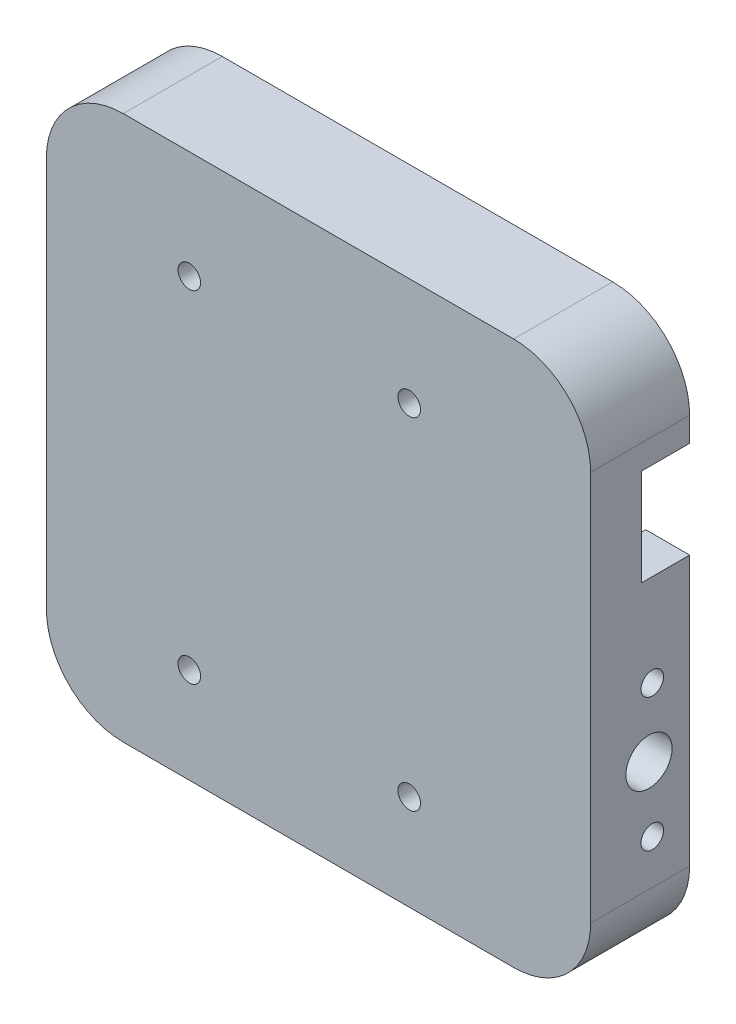
ISO-10303-21;
HEADER;
FILE_DESCRIPTION(('STEP AP214'),'2;1');
FILE_NAME('part.step','',(''),(''),'','','');
FILE_SCHEMA(('AUTOMOTIVE_DESIGN { 1 0 10303 214 1 1 1 1 }'));
ENDSEC;
DATA;
#1=APPLICATION_CONTEXT('core data for automotive mechanical design processes');
#2=APPLICATION_PROTOCOL_DEFINITION('international standard','automotive_design',2000,#1);
#3=PRODUCT_CONTEXT('',#1,'mechanical');
#4=PRODUCT('Part','Part','',(#3));
#5=PRODUCT_RELATED_PRODUCT_CATEGORY('part','',(#4));
#6=PRODUCT_DEFINITION_FORMATION('','',#4);
#7=PRODUCT_DEFINITION_CONTEXT('part definition',#1,'design');
#8=PRODUCT_DEFINITION('design','',#6,#7);
#9=PRODUCT_DEFINITION_SHAPE('','',#8);
#10=(LENGTH_UNIT() NAMED_UNIT(*) SI_UNIT(.MILLI.,.METRE.));
#11=(NAMED_UNIT(*) PLANE_ANGLE_UNIT() SI_UNIT($,.RADIAN.));
#12=(NAMED_UNIT(*) SI_UNIT($,.STERADIAN.) SOLID_ANGLE_UNIT());
#13=UNCERTAINTY_MEASURE_WITH_UNIT(LENGTH_MEASURE(1.E-05),#10,'distance_accuracy_value','');
#14=(GEOMETRIC_REPRESENTATION_CONTEXT(3) GLOBAL_UNCERTAINTY_ASSIGNED_CONTEXT((#13)) GLOBAL_UNIT_ASSIGNED_CONTEXT((#10,
#11,#12)) REPRESENTATION_CONTEXT('',''));
#15=CARTESIAN_POINT('',(0.,0.,0.));
#16=DIRECTION('',(0.,0.,1.));
#17=DIRECTION('',(1.,0.,0.));
#18=AXIS2_PLACEMENT_3D('',#15,#16,#17);
#19=CARTESIAN_POINT('',(-52.518,-41.686999999994,3.));
#20=DIRECTION('',(1.,0.,0.));
#21=DIRECTION('',(0.,1.,0.));
#22=AXIS2_PLACEMENT_3D('',#19,#20,#21);
#23=PLANE('',#22);
#24=CARTESIAN_POINT('',(-52.518,-61.078,-2.6));
#25=DIRECTION('',(-1.,0.,0.));
#26=DIRECTION('',(0.,0.,1.));
#27=AXIS2_PLACEMENT_3D('',#24,#25,#26);
#28=CIRCLE('',#27,1.02499999999998);
#29=CARTESIAN_POINT('',(-52.518,-61.078,-1.57500000000002));
#30=VERTEX_POINT('',#29);
#31=EDGE_CURVE('E224',#30,#30,#28,.T.);
#32=ORIENTED_EDGE('',*,*,#31,.T.);
#33=EDGE_LOOP('',(#32));
#34=FACE_BOUND('',#33,.T.);
#35=CARTESIAN_POINT('',(-52.518,-73.178,-2.6));
#36=DIRECTION('',(-1.,0.,0.));
#37=DIRECTION('',(0.,0.,1.));
#38=AXIS2_PLACEMENT_3D('',#35,#36,#37);
#39=CIRCLE('',#38,1.02499999999998);
#40=CARTESIAN_POINT('',(-52.518,-73.178,-1.57500000000002));
#41=VERTEX_POINT('',#40);
#42=EDGE_CURVE('E237',#41,#41,#39,.T.);
#43=ORIENTED_EDGE('',*,*,#42,.T.);
#44=EDGE_LOOP('',(#43));
#45=FACE_BOUND('',#44,.T.);
#46=CARTESIAN_POINT('',(-52.518,-67.128,-2.3));
#47=DIRECTION('',(1.,0.,0.));
#48=DIRECTION('',(0.,1.,0.));
#49=AXIS2_PLACEMENT_3D('',#46,#47,#48);
#50=CIRCLE('',#49,2.10000000000001);
#51=CARTESIAN_POINT('',(-52.518,-65.028,-2.3));
#52=VERTEX_POINT('',#51);
#53=EDGE_CURVE('E249',#52,#52,#50,.T.);
#54=ORIENTED_EDGE('',*,*,#53,.F.);
#55=EDGE_LOOP('',(#54));
#56=FACE_BOUND('',#55,.T.);
#57=DIRECTION('',(0.,-1.,0.));
#58=VECTOR('',#57,1.);
#59=CARTESIAN_POINT('',(-52.518,0.,-6.));
#60=LINE('',#59,#58);
#61=CARTESIAN_POINT('',(-52.518,-52.701999999994,-6.));
#62=VERTEX_POINT('',#61);
#63=CARTESIAN_POINT('',(-52.518,-77.186999999994,-6.));
#64=VERTEX_POINT('',#63);
#65=EDGE_CURVE('E208',#62,#64,#60,.T.);
#66=ORIENTED_EDGE('',*,*,#65,.F.);
#67=DIRECTION('',(0.,0.,-1.));
#68=VECTOR('',#67,1.);
#69=CARTESIAN_POINT('',(-52.518,-52.701999999994,-1.6));
#70=LINE('',#69,#68);
#71=CARTESIAN_POINT('',(-52.518,-52.701999999994,-1.6));
#72=VERTEX_POINT('',#71);
#73=EDGE_CURVE('E188',#72,#62,#70,.T.);
#74=ORIENTED_EDGE('',*,*,#73,.F.);
#75=DIRECTION('',(0.,-1.,0.));
#76=VECTOR('',#75,1.);
#77=CARTESIAN_POINT('',(-52.518,-43.901999999994,-1.6));
#78=LINE('',#77,#76);
#79=CARTESIAN_POINT('',(-52.518,-43.901999999994,-1.6));
#80=VERTEX_POINT('',#79);
#81=EDGE_CURVE('E195',#80,#72,#78,.T.);
#82=ORIENTED_EDGE('',*,*,#81,.F.);
#83=DIRECTION('',(0.,0.,-1.));
#84=VECTOR('',#83,1.);
#85=CARTESIAN_POINT('',(-52.518,-43.901999999994,-1.6));
#86=LINE('',#85,#84);
#87=CARTESIAN_POINT('',(-52.518,-43.901999999994,-6.));
#88=VERTEX_POINT('',#87);
#89=EDGE_CURVE('E210',#80,#88,#86,.T.);
#90=ORIENTED_EDGE('',*,*,#89,.T.);
#91=CARTESIAN_POINT('',(-52.518,-41.686999999994,-6.));
#92=VERTEX_POINT('',#91);
#93=EDGE_CURVE('E320',#92,#88,#60,.T.);
#94=ORIENTED_EDGE('',*,*,#93,.F.);
#95=DIRECTION('',(0.,0.,-1.));
#96=VECTOR('',#95,1.);
#97=CARTESIAN_POINT('',(-52.518,-41.686999999994,3.));
#98=LINE('',#97,#96);
#99=CARTESIAN_POINT('',(-52.518,-41.686999999994,3.));
#100=VERTEX_POINT('',#99);
#101=EDGE_CURVE('E414',#100,#92,#98,.T.);
#102=ORIENTED_EDGE('',*,*,#101,.F.);
#103=DIRECTION('',(0.,-1.,0.));
#104=VECTOR('',#103,1.);
#105=CARTESIAN_POINT('',(-52.518,-41.686999999994,3.));
#106=LINE('',#105,#104);
#107=CARTESIAN_POINT('',(-52.518,-77.186999999994,3.));
#108=VERTEX_POINT('',#107);
#109=EDGE_CURVE('E396',#100,#108,#106,.T.);
#110=ORIENTED_EDGE('',*,*,#109,.T.);
#111=DIRECTION('',(0.,0.,-1.));
#112=VECTOR('',#111,1.);
#113=CARTESIAN_POINT('',(-52.518,-77.186999999994,3.));
#114=LINE('',#113,#112);
#115=EDGE_CURVE('E417',#108,#64,#114,.T.);
#116=ORIENTED_EDGE('',*,*,#115,.T.);
#117=EDGE_LOOP('',(#66,#74,#82,#90,#94,#102,#110,#116));
#118=FACE_BOUND('',#117,.T.);
#119=ADVANCED_FACE('F45',(#34,#45,#56,#118),#23,.T.);
#120=CARTESIAN_POINT('',(-56.518,0.,-6.));
#121=DIRECTION('',(-1.,0.,0.));
#122=DIRECTION('',(0.,-1.,0.));
#123=AXIS2_PLACEMENT_3D('',#120,#121,#122);
#124=PLANE('',#123);
#125=CARTESIAN_POINT('',(-56.518,-61.078,-2.6));
#126=DIRECTION('',(-1.,0.,0.));
#127=DIRECTION('',(0.,-1.,0.));
#128=AXIS2_PLACEMENT_3D('',#125,#126,#127);
#129=CIRCLE('',#128,1.02499999999998);
#130=CARTESIAN_POINT('',(-56.518,-62.103,-2.6));
#131=VERTEX_POINT('',#130);
#132=EDGE_CURVE('E229',#131,#131,#129,.T.);
#133=ORIENTED_EDGE('',*,*,#132,.F.);
#134=EDGE_LOOP('',(#133));
#135=FACE_BOUND('',#134,.T.);
#136=CARTESIAN_POINT('',(-56.518,-73.178,-2.6));
#137=DIRECTION('',(-1.,0.,0.));
#138=DIRECTION('',(0.,-1.,0.));
#139=AXIS2_PLACEMENT_3D('',#136,#137,#138);
#140=CIRCLE('',#139,1.02499999999998);
#141=CARTESIAN_POINT('',(-56.518,-74.203,-2.6));
#142=VERTEX_POINT('',#141);
#143=EDGE_CURVE('E245',#142,#142,#140,.T.);
#144=ORIENTED_EDGE('',*,*,#143,.F.);
#145=EDGE_LOOP('',(#144));
#146=FACE_BOUND('',#145,.T.);
#147=CARTESIAN_POINT('',(-56.518,-67.128,-2.3));
#148=DIRECTION('',(-1.,0.,0.));
#149=DIRECTION('',(0.,-1.,0.));
#150=AXIS2_PLACEMENT_3D('',#147,#148,#149);
#151=CIRCLE('',#150,2.10000000000001);
#152=CARTESIAN_POINT('',(-56.518,-69.228,-2.3));
#153=VERTEX_POINT('',#152);
#154=EDGE_CURVE('E253',#153,#153,#151,.F.);
#155=ORIENTED_EDGE('',*,*,#154,.T.);
#156=EDGE_LOOP('',(#155));
#157=FACE_BOUND('',#156,.T.);
#158=DIRECTION('',(0.,1.,0.));
#159=VECTOR('',#158,1.);
#160=CARTESIAN_POINT('',(-56.518,0.,-1.6));
#161=LINE('',#160,#159);
#162=CARTESIAN_POINT('',(-56.518,-52.701999999994,-1.6));
#163=VERTEX_POINT('',#162);
#164=CARTESIAN_POINT('',(-56.518,-43.901999999994,-1.6));
#165=VERTEX_POINT('',#164);
#166=EDGE_CURVE('E11',#163,#165,#161,.T.);
#167=ORIENTED_EDGE('',*,*,#166,.F.);
#168=DIRECTION('',(0.,0.,-1.));
#169=VECTOR('',#168,1.);
#170=CARTESIAN_POINT('',(-56.518,-52.701999999994,-6.));
#171=LINE('',#170,#169);
#172=CARTESIAN_POINT('',(-56.518,-52.701999999994,-6.));
#173=VERTEX_POINT('',#172);
#174=EDGE_CURVE('E191',#163,#173,#171,.T.);
#175=ORIENTED_EDGE('',*,*,#174,.T.);
#176=DIRECTION('',(0.,-1.,0.));
#177=VECTOR('',#176,1.);
#178=CARTESIAN_POINT('',(-56.518,0.,-6.));
#179=LINE('',#178,#177);
#180=CARTESIAN_POINT('',(-56.518,-77.186999999994,-6.));
#181=VERTEX_POINT('',#180);
#182=EDGE_CURVE('E275',#173,#181,#179,.T.);
#183=ORIENTED_EDGE('',*,*,#182,.T.);
#184=DIRECTION('',(0.,0.,1.));
#185=VECTOR('',#184,1.);
#186=CARTESIAN_POINT('',(-56.518,-77.186999999994,-6.));
#187=LINE('',#186,#185);
#188=CARTESIAN_POINT('',(-56.518,-77.186999999994,0.));
#189=VERTEX_POINT('',#188);
#190=EDGE_CURVE('E373',#181,#189,#187,.T.);
#191=ORIENTED_EDGE('',*,*,#190,.T.);
#192=DIRECTION('',(0.,-1.,0.));
#193=VECTOR('',#192,1.);
#194=CARTESIAN_POINT('',(-56.518,0.,0.));
#195=LINE('',#194,#193);
#196=CARTESIAN_POINT('',(-56.518,-41.686999999994,0.));
#197=VERTEX_POINT('',#196);
#198=EDGE_CURVE('E71',#197,#189,#195,.T.);
#199=ORIENTED_EDGE('',*,*,#198,.F.);
#200=DIRECTION('',(0.,0.,1.));
#201=VECTOR('',#200,1.);
#202=CARTESIAN_POINT('',(-56.518,-41.686999999994,-6.));
#203=LINE('',#202,#201);
#204=CARTESIAN_POINT('',(-56.518,-41.686999999994,-6.));
#205=VERTEX_POINT('',#204);
#206=EDGE_CURVE('E376',#205,#197,#203,.T.);
#207=ORIENTED_EDGE('',*,*,#206,.F.);
#208=CARTESIAN_POINT('',(-56.518,-43.901999999994,-6.));
#209=VERTEX_POINT('',#208);
#210=EDGE_CURVE('E276',#205,#209,#179,.T.);
#211=ORIENTED_EDGE('',*,*,#210,.T.);
#212=DIRECTION('',(0.,0.,-1.));
#213=VECTOR('',#212,1.);
#214=CARTESIAN_POINT('',(-56.518,-43.901999999994,-6.));
#215=LINE('',#214,#213);
#216=EDGE_CURVE('E63',#165,#209,#215,.T.);
#217=ORIENTED_EDGE('',*,*,#216,.F.);
#218=EDGE_LOOP('',(#167,#175,#183,#191,#199,#207,#211,#217));
#219=FACE_BOUND('',#218,.T.);
#220=ADVANCED_FACE('F519',(#135,#146,#157,#219),#124,.T.);
#221=CARTESIAN_POINT('',(0.,0.,-6.));
#222=DIRECTION('',(0.,0.,1.));
#223=DIRECTION('',(1.,0.,0.));
#224=AXIS2_PLACEMENT_3D('',#221,#222,#223);
#225=PLANE('',#224);
#226=DIRECTION('',(-1.,0.,0.));
#227=VECTOR('',#226,1.);
#228=CARTESIAN_POINT('',(0.,-52.701999999994,-6.));
#229=LINE('',#228,#227);
#230=EDGE_CURVE('E55',#62,#173,#229,.T.);
#231=ORIENTED_EDGE('',*,*,#230,.F.);
#232=ORIENTED_EDGE('',*,*,#65,.T.);
#233=CARTESIAN_POINT('',(-59.518,-77.186999999994,-6.));
#234=DIRECTION('',(0.,0.,1.));
#235=DIRECTION('',(1.,0.,0.));
#236=AXIS2_PLACEMENT_3D('',#233,#234,#235);
#237=CIRCLE('',#236,7.);
#238=CARTESIAN_POINT('',(-59.518,-84.186999999994,-6.));
#239=VERTEX_POINT('',#238);
#240=EDGE_CURVE('E316',#239,#64,#237,.T.);
#241=ORIENTED_EDGE('',*,*,#240,.F.);
#242=DIRECTION('',(1.,0.,0.));
#243=VECTOR('',#242,1.);
#244=CARTESIAN_POINT('',(0.,-84.186999999994,-6.));
#245=LINE('',#244,#243);
#246=CARTESIAN_POINT('',(-95.018,-84.186999999994,-6.));
#247=VERTEX_POINT('',#246);
#248=EDGE_CURVE('E312',#247,#239,#245,.T.);
#249=ORIENTED_EDGE('',*,*,#248,.F.);
#250=CARTESIAN_POINT('',(-95.018,-77.186999999994,-6.));
#251=DIRECTION('',(0.,0.,1.));
#252=DIRECTION('',(1.,0.,0.));
#253=AXIS2_PLACEMENT_3D('',#250,#251,#252);
#254=CIRCLE('',#253,7.00000000000001);
#255=CARTESIAN_POINT('',(-102.018,-77.186999999994,-6.));
#256=VERTEX_POINT('',#255);
#257=EDGE_CURVE('E308',#256,#247,#254,.T.);
#258=ORIENTED_EDGE('',*,*,#257,.F.);
#259=DIRECTION('',(0.,-1.,0.));
#260=VECTOR('',#259,1.);
#261=CARTESIAN_POINT('',(-102.018,0.,-6.));
#262=LINE('',#261,#260);
#263=CARTESIAN_POINT('',(-102.018,-41.686999999994,-6.));
#264=VERTEX_POINT('',#263);
#265=EDGE_CURVE('E304',#264,#256,#262,.T.);
#266=ORIENTED_EDGE('',*,*,#265,.F.);
#267=CARTESIAN_POINT('',(-95.018,-41.686999999994,-6.));
#268=DIRECTION('',(0.,0.,1.));
#269=DIRECTION('',(1.,0.,0.));
#270=AXIS2_PLACEMENT_3D('',#267,#268,#269);
#271=CIRCLE('',#270,7.);
#272=CARTESIAN_POINT('',(-95.018,-34.686999999994,-6.));
#273=VERTEX_POINT('',#272);
#274=EDGE_CURVE('E300',#273,#264,#271,.T.);
#275=ORIENTED_EDGE('',*,*,#274,.F.);
#276=DIRECTION('',(1.,0.,0.));
#277=VECTOR('',#276,1.);
#278=CARTESIAN_POINT('',(0.,-34.686999999994,-6.));
#279=LINE('',#278,#277);
#280=CARTESIAN_POINT('',(-59.518,-34.686999999994,-6.));
#281=VERTEX_POINT('',#280);
#282=EDGE_CURVE('E296',#273,#281,#279,.T.);
#283=ORIENTED_EDGE('',*,*,#282,.T.);
#284=CARTESIAN_POINT('',(-59.518,-41.686999999994,-6.));
#285=DIRECTION('',(0.,0.,1.));
#286=DIRECTION('',(1.,0.,0.));
#287=AXIS2_PLACEMENT_3D('',#284,#285,#286);
#288=CIRCLE('',#287,7.);
#289=EDGE_CURVE('E324',#281,#92,#288,.F.);
#290=ORIENTED_EDGE('',*,*,#289,.T.);
#291=ORIENTED_EDGE('',*,*,#93,.T.);
#292=DIRECTION('',(-1.,0.,0.));
#293=VECTOR('',#292,1.);
#294=CARTESIAN_POINT('',(0.,-43.901999999994,-6.));
#295=LINE('',#294,#293);
#296=EDGE_CURVE('E432',#88,#209,#295,.T.);
#297=ORIENTED_EDGE('',*,*,#296,.T.);
#298=ORIENTED_EDGE('',*,*,#210,.F.);
#299=CARTESIAN_POINT('',(-59.518,-41.686999999994,-6.));
#300=DIRECTION('',(0.,0.,1.));
#301=DIRECTION('',(1.,0.,0.));
#302=AXIS2_PLACEMENT_3D('',#299,#300,#301);
#303=CIRCLE('',#302,3.);
#304=CARTESIAN_POINT('',(-59.518,-38.686999999994,-6.));
#305=VERTEX_POINT('',#304);
#306=EDGE_CURVE('E270',#305,#205,#303,.F.);
#307=ORIENTED_EDGE('',*,*,#306,.F.);
#308=DIRECTION('',(1.,0.,0.));
#309=VECTOR('',#308,1.);
#310=CARTESIAN_POINT('',(0.,-38.686999999994,-6.));
#311=LINE('',#310,#309);
#312=CARTESIAN_POINT('',(-95.018,-38.686999999994,-6.));
#313=VERTEX_POINT('',#312);
#314=EDGE_CURVE('E266',#313,#305,#311,.T.);
#315=ORIENTED_EDGE('',*,*,#314,.F.);
#316=CARTESIAN_POINT('',(-95.018,-41.686999999994,-6.));
#317=DIRECTION('',(0.,0.,1.));
#318=DIRECTION('',(1.,0.,0.));
#319=AXIS2_PLACEMENT_3D('',#316,#317,#318);
#320=CIRCLE('',#319,3.);
#321=CARTESIAN_POINT('',(-98.018,-41.686999999994,-6.));
#322=VERTEX_POINT('',#321);
#323=EDGE_CURVE('E293',#313,#322,#320,.T.);
#324=ORIENTED_EDGE('',*,*,#323,.T.);
#325=DIRECTION('',(0.,-1.,0.));
#326=VECTOR('',#325,1.);
#327=CARTESIAN_POINT('',(-98.018,0.,-6.));
#328=LINE('',#327,#326);
#329=CARTESIAN_POINT('',(-98.018,-77.186999999994,-6.));
#330=VERTEX_POINT('',#329);
#331=EDGE_CURVE('E290',#322,#330,#328,.T.);
#332=ORIENTED_EDGE('',*,*,#331,.T.);
#333=CARTESIAN_POINT('',(-95.018,-77.186999999994,-6.));
#334=DIRECTION('',(0.,0.,1.));
#335=DIRECTION('',(1.,0.,0.));
#336=AXIS2_PLACEMENT_3D('',#333,#334,#335);
#337=CIRCLE('',#336,3.00000000000001);
#338=CARTESIAN_POINT('',(-95.018,-80.186999999994,-6.));
#339=VERTEX_POINT('',#338);
#340=EDGE_CURVE('E287',#330,#339,#337,.T.);
#341=ORIENTED_EDGE('',*,*,#340,.T.);
#342=DIRECTION('',(1.,0.,0.));
#343=VECTOR('',#342,1.);
#344=CARTESIAN_POINT('',(0.,-80.186999999994,-6.));
#345=LINE('',#344,#343);
#346=CARTESIAN_POINT('',(-59.518,-80.186999999994,-6.));
#347=VERTEX_POINT('',#346);
#348=EDGE_CURVE('E284',#339,#347,#345,.T.);
#349=ORIENTED_EDGE('',*,*,#348,.T.);
#350=CARTESIAN_POINT('',(-59.518,-77.186999999994,-6.));
#351=DIRECTION('',(0.,0.,1.));
#352=DIRECTION('',(1.,0.,0.));
#353=AXIS2_PLACEMENT_3D('',#350,#351,#352);
#354=CIRCLE('',#353,3.);
#355=EDGE_CURVE('E280',#347,#181,#354,.T.);
#356=ORIENTED_EDGE('',*,*,#355,.T.);
#357=ORIENTED_EDGE('',*,*,#182,.F.);
#358=EDGE_LOOP('',(#231,#232,#241,#249,#258,#266,#275,#283,#290,#291,#297,#298,#307,#315,#324,
#332,#341,#349,#356,#357));
#359=FACE_BOUND('',#358,.T.);
#360=ADVANCED_FACE('F494',(#359),#225,.F.);
#361=CARTESIAN_POINT('',(-95.018,-41.686999999994,3.));
#362=DIRECTION('',(0.,0.,-1.));
#363=DIRECTION('',(-1.,0.,0.));
#364=AXIS2_PLACEMENT_3D('',#361,#362,#363);
#365=CYLINDRICAL_SURFACE('',#364,7.);
#366=DIRECTION('',(0.,0.,-1.));
#367=VECTOR('',#366,1.);
#368=CARTESIAN_POINT('',(-95.018,-34.686999999994,3.));
#369=LINE('',#368,#367);
#370=CARTESIAN_POINT('',(-95.018,-34.686999999994,3.));
#371=VERTEX_POINT('',#370);
#372=EDGE_CURVE('E408',#371,#273,#369,.T.);
#373=ORIENTED_EDGE('',*,*,#372,.T.);
#374=ORIENTED_EDGE('',*,*,#274,.T.);
#375=DIRECTION('',(0.,0.,-1.));
#376=VECTOR('',#375,1.);
#377=CARTESIAN_POINT('',(-102.018,-41.686999999994,3.));
#378=LINE('',#377,#376);
#379=CARTESIAN_POINT('',(-102.018,-41.686999999994,3.));
#380=VERTEX_POINT('',#379);
#381=EDGE_CURVE('E429',#380,#264,#378,.T.);
#382=ORIENTED_EDGE('',*,*,#381,.F.);
#383=CARTESIAN_POINT('',(-95.018,-41.686999999994,3.));
#384=DIRECTION('',(0.,0.,1.));
#385=DIRECTION('',(1.,0.,0.));
#386=AXIS2_PLACEMENT_3D('',#383,#384,#385);
#387=CIRCLE('',#386,7.);
#388=EDGE_CURVE('E356',#371,#380,#387,.T.);
#389=ORIENTED_EDGE('',*,*,#388,.F.);
#390=EDGE_LOOP('',(#373,#374,#382,#389));
#391=FACE_BOUND('',#390,.T.);
#392=ADVANCED_FACE('F47',(#391),#365,.T.);
#393=CARTESIAN_POINT('',(-102.018,-41.686999999994,3.));
#394=DIRECTION('',(1.,0.,0.));
#395=DIRECTION('',(0.,0.,-1.));
#396=AXIS2_PLACEMENT_3D('',#393,#394,#395);
#397=PLANE('',#396);
#398=CARTESIAN_POINT('',(-102.018,-61.078,-2.6));
#399=DIRECTION('',(-1.,0.,0.));
#400=DIRECTION('',(0.,0.,1.));
#401=AXIS2_PLACEMENT_3D('',#398,#399,#400);
#402=CIRCLE('',#401,1.02499999999998);
#403=CARTESIAN_POINT('',(-102.018,-61.078,-1.57500000000002));
#404=VERTEX_POINT('',#403);
#405=EDGE_CURVE('E220',#404,#404,#402,.T.);
#406=ORIENTED_EDGE('',*,*,#405,.F.);
#407=EDGE_LOOP('',(#406));
#408=FACE_BOUND('',#407,.T.);
#409=CARTESIAN_POINT('',(-102.018,-73.178,-2.6));
#410=DIRECTION('',(-1.,0.,0.));
#411=DIRECTION('',(0.,0.,1.));
#412=AXIS2_PLACEMENT_3D('',#409,#410,#411);
#413=CIRCLE('',#412,1.02499999999998);
#414=CARTESIAN_POINT('',(-102.018,-73.178,-1.57500000000002));
#415=VERTEX_POINT('',#414);
#416=EDGE_CURVE('E233',#415,#415,#413,.T.);
#417=ORIENTED_EDGE('',*,*,#416,.F.);
#418=EDGE_LOOP('',(#417));
#419=FACE_BOUND('',#418,.T.);
#420=CARTESIAN_POINT('',(-102.018,-67.128,-2.6));
#421=DIRECTION('',(-1.,0.,0.));
#422=DIRECTION('',(0.,0.,1.));
#423=AXIS2_PLACEMENT_3D('',#420,#421,#422);
#424=CIRCLE('',#423,2.10000000000001);
#425=CARTESIAN_POINT('',(-102.018,-67.128,-0.499999999999988));
#426=VERTEX_POINT('',#425);
#427=EDGE_CURVE('E257',#426,#426,#424,.T.);
#428=ORIENTED_EDGE('',*,*,#427,.F.);
#429=EDGE_LOOP('',(#428));
#430=FACE_BOUND('',#429,.T.);
#431=ORIENTED_EDGE('',*,*,#381,.T.);
#432=ORIENTED_EDGE('',*,*,#265,.T.);
#433=DIRECTION('',(0.,0.,-1.));
#434=VECTOR('',#433,1.);
#435=CARTESIAN_POINT('',(-102.018,-77.186999999994,3.));
#436=LINE('',#435,#434);
#437=CARTESIAN_POINT('',(-102.018,-77.186999999994,3.));
#438=VERTEX_POINT('',#437);
#439=EDGE_CURVE('E426',#438,#256,#436,.T.);
#440=ORIENTED_EDGE('',*,*,#439,.F.);
#441=DIRECTION('',(0.,-1.,0.));
#442=VECTOR('',#441,1.);
#443=CARTESIAN_POINT('',(-102.018,-41.686999999994,3.));
#444=LINE('',#443,#442);
#445=EDGE_CURVE('E384',#380,#438,#444,.T.);
#446=ORIENTED_EDGE('',*,*,#445,.F.);
#447=EDGE_LOOP('',(#431,#432,#440,#446));
#448=FACE_BOUND('',#447,.T.);
#449=ADVANCED_FACE('F491',(#408,#419,#430,#448),#397,.F.);
#450=CARTESIAN_POINT('',(-95.018,-77.186999999994,3.));
#451=DIRECTION('',(0.,0.,-1.));
#452=DIRECTION('',(-1.,0.,0.));
#453=AXIS2_PLACEMENT_3D('',#450,#451,#452);
#454=CYLINDRICAL_SURFACE('',#453,7.00000000000001);
#455=ORIENTED_EDGE('',*,*,#439,.T.);
#456=ORIENTED_EDGE('',*,*,#257,.T.);
#457=DIRECTION('',(0.,0.,-1.));
#458=VECTOR('',#457,1.);
#459=CARTESIAN_POINT('',(-95.018,-84.186999999994,3.));
#460=LINE('',#459,#458);
#461=CARTESIAN_POINT('',(-95.018,-84.186999999994,3.));
#462=VERTEX_POINT('',#461);
#463=EDGE_CURVE('E423',#462,#247,#460,.T.);
#464=ORIENTED_EDGE('',*,*,#463,.F.);
#465=CARTESIAN_POINT('',(-95.018,-77.186999999994,3.));
#466=DIRECTION('',(0.,0.,1.));
#467=DIRECTION('',(1.,0.,0.));
#468=AXIS2_PLACEMENT_3D('',#465,#466,#467);
#469=CIRCLE('',#468,7.00000000000001);
#470=EDGE_CURVE('E387',#438,#462,#469,.T.);
#471=ORIENTED_EDGE('',*,*,#470,.F.);
#472=EDGE_LOOP('',(#455,#456,#464,#471));
#473=FACE_BOUND('',#472,.T.);
#474=ADVANCED_FACE('F499',(#473),#454,.T.);
#475=CARTESIAN_POINT('',(-95.018,-84.186999999994,3.));
#476=DIRECTION('',(0.,1.,0.));
#477=DIRECTION('',(0.,0.,1.));
#478=AXIS2_PLACEMENT_3D('',#475,#476,#477);
#479=PLANE('',#478);
#480=ORIENTED_EDGE('',*,*,#463,.T.);
#481=ORIENTED_EDGE('',*,*,#248,.T.);
#482=DIRECTION('',(0.,0.,-1.));
#483=VECTOR('',#482,1.);
#484=CARTESIAN_POINT('',(-59.518,-84.186999999994,3.));
#485=LINE('',#484,#483);
#486=CARTESIAN_POINT('',(-59.518,-84.186999999994,3.));
#487=VERTEX_POINT('',#486);
#488=EDGE_CURVE('E420',#487,#239,#485,.T.);
#489=ORIENTED_EDGE('',*,*,#488,.F.);
#490=DIRECTION('',(1.,0.,0.));
#491=VECTOR('',#490,1.);
#492=CARTESIAN_POINT('',(-95.018,-84.186999999994,3.));
#493=LINE('',#492,#491);
#494=EDGE_CURVE('E390',#462,#487,#493,.T.);
#495=ORIENTED_EDGE('',*,*,#494,.F.);
#496=EDGE_LOOP('',(#480,#481,#489,#495));
#497=FACE_BOUND('',#496,.T.);
#498=ADVANCED_FACE('F507',(#497),#479,.F.);
#499=CARTESIAN_POINT('',(-59.518,-77.186999999994,3.));
#500=DIRECTION('',(0.,0.,-1.));
#501=DIRECTION('',(-1.,0.,0.));
#502=AXIS2_PLACEMENT_3D('',#499,#500,#501);
#503=CYLINDRICAL_SURFACE('',#502,7.);
#504=ORIENTED_EDGE('',*,*,#488,.T.);
#505=ORIENTED_EDGE('',*,*,#240,.T.);
#506=ORIENTED_EDGE('',*,*,#115,.F.);
#507=CARTESIAN_POINT('',(-59.518,-77.186999999994,3.));
#508=DIRECTION('',(0.,0.,1.));
#509=DIRECTION('',(1.,0.,0.));
#510=AXIS2_PLACEMENT_3D('',#507,#508,#509);
#511=CIRCLE('',#510,7.);
#512=EDGE_CURVE('E393',#487,#108,#511,.T.);
#513=ORIENTED_EDGE('',*,*,#512,.F.);
#514=EDGE_LOOP('',(#504,#505,#506,#513));
#515=FACE_BOUND('',#514,.T.);
#516=ADVANCED_FACE('F509',(#515),#503,.T.);
#517=CARTESIAN_POINT('',(-59.518,-41.686999999994,3.));
#518=DIRECTION('',(0.,0.,-1.));
#519=DIRECTION('',(-1.,0.,0.));
#520=AXIS2_PLACEMENT_3D('',#517,#518,#519);
#521=CYLINDRICAL_SURFACE('',#520,7.);
#522=ORIENTED_EDGE('',*,*,#101,.T.);
#523=ORIENTED_EDGE('',*,*,#289,.F.);
#524=DIRECTION('',(0.,0.,-1.));
#525=VECTOR('',#524,1.);
#526=CARTESIAN_POINT('',(-59.518,-34.686999999994,3.));
#527=LINE('',#526,#525);
#528=CARTESIAN_POINT('',(-59.518,-34.686999999994,3.));
#529=VERTEX_POINT('',#528);
#530=EDGE_CURVE('E411',#529,#281,#527,.T.);
#531=ORIENTED_EDGE('',*,*,#530,.F.);
#532=CARTESIAN_POINT('',(-59.518,-41.686999999994,3.));
#533=DIRECTION('',(0.,0.,-1.));
#534=DIRECTION('',(-1.,0.,0.));
#535=AXIS2_PLACEMENT_3D('',#532,#533,#534);
#536=CIRCLE('',#535,7.);
#537=EDGE_CURVE('E400',#529,#100,#536,.T.);
#538=ORIENTED_EDGE('',*,*,#537,.T.);
#539=EDGE_LOOP('',(#522,#523,#531,#538));
#540=FACE_BOUND('',#539,.T.);
#541=ADVANCED_FACE('F512',(#540),#521,.T.);
#542=CARTESIAN_POINT('',(-95.018,-34.686999999994,3.));
#543=DIRECTION('',(0.,1.,0.));
#544=DIRECTION('',(0.,0.,1.));
#545=AXIS2_PLACEMENT_3D('',#542,#543,#544);
#546=PLANE('',#545);
#547=ORIENTED_EDGE('',*,*,#530,.T.);
#548=ORIENTED_EDGE('',*,*,#282,.F.);
#549=ORIENTED_EDGE('',*,*,#372,.F.);
#550=DIRECTION('',(1.,0.,0.));
#551=VECTOR('',#550,1.);
#552=CARTESIAN_POINT('',(-95.018,-34.686999999994,3.));
#553=LINE('',#552,#551);
#554=EDGE_CURVE('E404',#371,#529,#553,.T.);
#555=ORIENTED_EDGE('',*,*,#554,.T.);
#556=EDGE_LOOP('',(#547,#548,#549,#555));
#557=FACE_BOUND('',#556,.T.);
#558=ADVANCED_FACE('F479',(#557),#546,.T.);
#559=CARTESIAN_POINT('',(-95.018,-41.686999999994,3.));
#560=DIRECTION('',(0.,0.,1.));
#561=DIRECTION('',(1.,0.,0.));
#562=AXIS2_PLACEMENT_3D('',#559,#560,#561);
#563=PLANE('',#562);
#564=CARTESIAN_POINT('',(-89.018,-44.496999999994,3.));
#565=DIRECTION('',(0.,0.,1.));
#566=DIRECTION('',(1.,0.,0.));
#567=AXIS2_PLACEMENT_3D('',#564,#565,#566);
#568=CIRCLE('',#567,1.025);
#569=CARTESIAN_POINT('',(-87.993,-44.496999999994,3.));
#570=VERTEX_POINT('',#569);
#571=EDGE_CURVE('E464',#570,#570,#568,.T.);
#572=ORIENTED_EDGE('',*,*,#571,.F.);
#573=EDGE_LOOP('',(#572));
#574=FACE_BOUND('',#573,.T.);
#575=CARTESIAN_POINT('',(-69.018,-44.496999999994,3.));
#576=DIRECTION('',(0.,0.,1.));
#577=DIRECTION('',(1.,0.,0.));
#578=AXIS2_PLACEMENT_3D('',#575,#576,#577);
#579=CIRCLE('',#578,1.025);
#580=CARTESIAN_POINT('',(-67.993,-44.496999999994,3.));
#581=VERTEX_POINT('',#580);
#582=EDGE_CURVE('E451',#581,#581,#579,.T.);
#583=ORIENTED_EDGE('',*,*,#582,.F.);
#584=EDGE_LOOP('',(#583));
#585=FACE_BOUND('',#584,.T.);
#586=CARTESIAN_POINT('',(-69.018,-75.496999999994,3.));
#587=DIRECTION('',(0.,0.,1.));
#588=DIRECTION('',(1.,0.,0.));
#589=AXIS2_PLACEMENT_3D('',#586,#587,#588);
#590=CIRCLE('',#589,1.025);
#591=CARTESIAN_POINT('',(-67.993,-75.496999999994,3.));
#592=VERTEX_POINT('',#591);
#593=EDGE_CURVE('E447',#592,#592,#590,.T.);
#594=ORIENTED_EDGE('',*,*,#593,.F.);
#595=EDGE_LOOP('',(#594));
#596=FACE_BOUND('',#595,.T.);
#597=CARTESIAN_POINT('',(-89.018,-75.496999999994,3.));
#598=DIRECTION('',(0.,0.,1.));
#599=DIRECTION('',(1.,0.,0.));
#600=AXIS2_PLACEMENT_3D('',#597,#598,#599);
#601=CIRCLE('',#600,1.025);
#602=CARTESIAN_POINT('',(-87.993,-75.496999999994,3.));
#603=VERTEX_POINT('',#602);
#604=EDGE_CURVE('E443',#603,#603,#601,.T.);
#605=ORIENTED_EDGE('',*,*,#604,.F.);
#606=EDGE_LOOP('',(#605));
#607=FACE_BOUND('',#606,.T.);
#608=ORIENTED_EDGE('',*,*,#388,.T.);
#609=ORIENTED_EDGE('',*,*,#445,.T.);
#610=ORIENTED_EDGE('',*,*,#470,.T.);
#611=ORIENTED_EDGE('',*,*,#494,.T.);
#612=ORIENTED_EDGE('',*,*,#512,.T.);
#613=ORIENTED_EDGE('',*,*,#109,.F.);
#614=ORIENTED_EDGE('',*,*,#537,.F.);
#615=ORIENTED_EDGE('',*,*,#554,.F.);
#616=EDGE_LOOP('',(#608,#609,#610,#611,#612,#613,#614,#615));
#617=FACE_BOUND('',#616,.T.);
#618=ADVANCED_FACE('F475',(#574,#585,#596,#607,#617),#563,.T.);
#619=CARTESIAN_POINT('',(0.,-38.686999999994,-6.));
#620=DIRECTION('',(0.,-1.,0.));
#621=DIRECTION('',(0.,0.,-1.));
#622=AXIS2_PLACEMENT_3D('',#619,#620,#621);
#623=PLANE('',#622);
#624=DIRECTION('',(1.,0.,0.));
#625=VECTOR('',#624,1.);
#626=CARTESIAN_POINT('',(0.,-38.686999999994,0.));
#627=LINE('',#626,#625);
#628=CARTESIAN_POINT('',(-95.018,-38.686999999994,0.));
#629=VERTEX_POINT('',#628);
#630=CARTESIAN_POINT('',(-59.518,-38.686999999994,0.));
#631=VERTEX_POINT('',#630);
#632=EDGE_CURVE('E265',#629,#631,#627,.T.);
#633=ORIENTED_EDGE('',*,*,#632,.F.);
#634=DIRECTION('',(0.,0.,1.));
#635=VECTOR('',#634,1.);
#636=CARTESIAN_POINT('',(-95.018,-38.686999999994,-6.));
#637=LINE('',#636,#635);
#638=EDGE_CURVE('E353',#313,#629,#637,.T.);
#639=ORIENTED_EDGE('',*,*,#638,.F.);
#640=ORIENTED_EDGE('',*,*,#314,.T.);
#641=DIRECTION('',(0.,0.,1.));
#642=VECTOR('',#641,1.);
#643=CARTESIAN_POINT('',(-59.518,-38.686999999994,-6.));
#644=LINE('',#643,#642);
#645=EDGE_CURVE('E328',#305,#631,#644,.T.);
#646=ORIENTED_EDGE('',*,*,#645,.T.);
#647=EDGE_LOOP('',(#633,#639,#640,#646));
#648=FACE_BOUND('',#647,.T.);
#649=ADVANCED_FACE('F478',(#648),#623,.T.);
#650=CARTESIAN_POINT('',(-95.018,-41.686999999994,-6.));
#651=DIRECTION('',(0.,0.,1.));
#652=DIRECTION('',(1.,0.,0.));
#653=AXIS2_PLACEMENT_3D('',#650,#651,#652);
#654=CYLINDRICAL_SURFACE('',#653,3.);
#655=CARTESIAN_POINT('',(-95.018,-41.686999999994,0.));
#656=DIRECTION('',(0.,0.,1.));
#657=DIRECTION('',(1.,0.,0.));
#658=AXIS2_PLACEMENT_3D('',#655,#656,#657);
#659=CIRCLE('',#658,3.);
#660=CARTESIAN_POINT('',(-98.018,-41.686999999994,0.));
#661=VERTEX_POINT('',#660);
#662=EDGE_CURVE('E271',#629,#661,#659,.T.);
#663=ORIENTED_EDGE('',*,*,#662,.T.);
#664=DIRECTION('',(0.,0.,1.));
#665=VECTOR('',#664,1.);
#666=CARTESIAN_POINT('',(-98.018,-41.686999999994,-6.));
#667=LINE('',#666,#665);
#668=EDGE_CURVE('E357',#322,#661,#667,.T.);
#669=ORIENTED_EDGE('',*,*,#668,.F.);
#670=ORIENTED_EDGE('',*,*,#323,.F.);
#671=ORIENTED_EDGE('',*,*,#638,.T.);
#672=EDGE_LOOP('',(#663,#669,#670,#671));
#673=FACE_BOUND('',#672,.T.);
#674=ADVANCED_FACE('F536',(#673),#654,.F.);
#675=CARTESIAN_POINT('',(-98.018,0.,-6.));
#676=DIRECTION('',(-1.,0.,0.));
#677=DIRECTION('',(0.,-1.,0.));
#678=AXIS2_PLACEMENT_3D('',#675,#676,#677);
#679=PLANE('',#678);
#680=CARTESIAN_POINT('',(-98.018,-61.078,-2.6));
#681=DIRECTION('',(-1.,0.,0.));
#682=DIRECTION('',(0.,-1.,0.));
#683=AXIS2_PLACEMENT_3D('',#680,#681,#682);
#684=CIRCLE('',#683,1.02499999999998);
#685=CARTESIAN_POINT('',(-98.018,-62.103,-2.6));
#686=VERTEX_POINT('',#685);
#687=EDGE_CURVE('E228',#686,#686,#684,.T.);
#688=ORIENTED_EDGE('',*,*,#687,.T.);
#689=EDGE_LOOP('',(#688));
#690=FACE_BOUND('',#689,.T.);
#691=CARTESIAN_POINT('',(-98.018,-73.178,-2.6));
#692=DIRECTION('',(-1.,0.,0.));
#693=DIRECTION('',(0.,-1.,0.));
#694=AXIS2_PLACEMENT_3D('',#691,#692,#693);
#695=CIRCLE('',#694,1.02499999999998);
#696=CARTESIAN_POINT('',(-98.018,-74.203,-2.6));
#697=VERTEX_POINT('',#696);
#698=EDGE_CURVE('E241',#697,#697,#695,.T.);
#699=ORIENTED_EDGE('',*,*,#698,.T.);
#700=EDGE_LOOP('',(#699));
#701=FACE_BOUND('',#700,.T.);
#702=CARTESIAN_POINT('',(-98.018,-67.128,-2.6));
#703=DIRECTION('',(-1.,0.,0.));
#704=DIRECTION('',(0.,-1.,0.));
#705=AXIS2_PLACEMENT_3D('',#702,#703,#704);
#706=CIRCLE('',#705,2.10000000000001);
#707=CARTESIAN_POINT('',(-98.018,-69.228,-2.6));
#708=VERTEX_POINT('',#707);
#709=EDGE_CURVE('E261',#708,#708,#706,.F.);
#710=ORIENTED_EDGE('',*,*,#709,.F.);
#711=EDGE_LOOP('',(#710));
#712=FACE_BOUND('',#711,.T.);
#713=DIRECTION('',(0.,-1.,0.));
#714=VECTOR('',#713,1.);
#715=CARTESIAN_POINT('',(-98.018,0.,0.));
#716=LINE('',#715,#714);
#717=CARTESIAN_POINT('',(-98.018,-77.186999999994,0.));
#718=VERTEX_POINT('',#717);
#719=EDGE_CURVE('E348',#661,#718,#716,.T.);
#720=ORIENTED_EDGE('',*,*,#719,.T.);
#721=DIRECTION('',(0.,0.,1.));
#722=VECTOR('',#721,1.);
#723=CARTESIAN_POINT('',(-98.018,-77.186999999994,-6.));
#724=LINE('',#723,#722);
#725=EDGE_CURVE('E361',#330,#718,#724,.T.);
#726=ORIENTED_EDGE('',*,*,#725,.F.);
#727=ORIENTED_EDGE('',*,*,#331,.F.);
#728=ORIENTED_EDGE('',*,*,#668,.T.);
#729=EDGE_LOOP('',(#720,#726,#727,#728));
#730=FACE_BOUND('',#729,.T.);
#731=ADVANCED_FACE('F538',(#690,#701,#712,#730),#679,.F.);
#732=CARTESIAN_POINT('',(-95.018,-77.186999999994,-6.));
#733=DIRECTION('',(0.,0.,1.));
#734=DIRECTION('',(1.,0.,0.));
#735=AXIS2_PLACEMENT_3D('',#732,#733,#734);
#736=CYLINDRICAL_SURFACE('',#735,3.00000000000001);
#737=CARTESIAN_POINT('',(-95.018,-77.186999999994,0.));
#738=DIRECTION('',(0.,0.,1.));
#739=DIRECTION('',(1.,0.,0.));
#740=AXIS2_PLACEMENT_3D('',#737,#738,#739);
#741=CIRCLE('',#740,3.00000000000001);
#742=CARTESIAN_POINT('',(-95.018,-80.186999999994,0.));
#743=VERTEX_POINT('',#742);
#744=EDGE_CURVE('E345',#718,#743,#741,.T.);
#745=ORIENTED_EDGE('',*,*,#744,.T.);
#746=DIRECTION('',(0.,0.,1.));
#747=VECTOR('',#746,1.);
#748=CARTESIAN_POINT('',(-95.018,-80.186999999994,-6.));
#749=LINE('',#748,#747);
#750=EDGE_CURVE('E365',#339,#743,#749,.T.);
#751=ORIENTED_EDGE('',*,*,#750,.F.);
#752=ORIENTED_EDGE('',*,*,#340,.F.);
#753=ORIENTED_EDGE('',*,*,#725,.T.);
#754=EDGE_LOOP('',(#745,#751,#752,#753));
#755=FACE_BOUND('',#754,.T.);
#756=ADVANCED_FACE('F543',(#755),#736,.F.);
#757=CARTESIAN_POINT('',(0.,-80.186999999994,-6.));
#758=DIRECTION('',(0.,-1.,0.));
#759=DIRECTION('',(1.,0.,0.));
#760=AXIS2_PLACEMENT_3D('',#757,#758,#759);
#761=PLANE('',#760);
#762=DIRECTION('',(1.,0.,0.));
#763=VECTOR('',#762,1.);
#764=CARTESIAN_POINT('',(0.,-80.186999999994,0.));
#765=LINE('',#764,#763);
#766=CARTESIAN_POINT('',(-59.518,-80.186999999994,0.));
#767=VERTEX_POINT('',#766);
#768=EDGE_CURVE('E342',#743,#767,#765,.T.);
#769=ORIENTED_EDGE('',*,*,#768,.T.);
#770=DIRECTION('',(0.,0.,1.));
#771=VECTOR('',#770,1.);
#772=CARTESIAN_POINT('',(-59.518,-80.186999999994,-6.));
#773=LINE('',#772,#771);
#774=EDGE_CURVE('E369',#347,#767,#773,.T.);
#775=ORIENTED_EDGE('',*,*,#774,.F.);
#776=ORIENTED_EDGE('',*,*,#348,.F.);
#777=ORIENTED_EDGE('',*,*,#750,.T.);
#778=EDGE_LOOP('',(#769,#775,#776,#777));
#779=FACE_BOUND('',#778,.T.);
#780=ADVANCED_FACE('F550',(#779),#761,.F.);
#781=CARTESIAN_POINT('',(-59.518,-77.186999999994,-6.));
#782=DIRECTION('',(0.,0.,1.));
#783=DIRECTION('',(1.,0.,0.));
#784=AXIS2_PLACEMENT_3D('',#781,#782,#783);
#785=CYLINDRICAL_SURFACE('',#784,3.);
#786=CARTESIAN_POINT('',(-59.518,-77.186999999994,0.));
#787=DIRECTION('',(0.,0.,1.));
#788=DIRECTION('',(1.,0.,0.));
#789=AXIS2_PLACEMENT_3D('',#786,#787,#788);
#790=CIRCLE('',#789,3.);
#791=EDGE_CURVE('E338',#767,#189,#790,.T.);
#792=ORIENTED_EDGE('',*,*,#791,.T.);
#793=ORIENTED_EDGE('',*,*,#190,.F.);
#794=ORIENTED_EDGE('',*,*,#355,.F.);
#795=ORIENTED_EDGE('',*,*,#774,.T.);
#796=EDGE_LOOP('',(#792,#793,#794,#795));
#797=FACE_BOUND('',#796,.T.);
#798=ADVANCED_FACE('F553',(#797),#785,.F.);
#799=CARTESIAN_POINT('',(-59.518,-41.686999999994,-6.));
#800=DIRECTION('',(0.,0.,1.));
#801=DIRECTION('',(1.,0.,0.));
#802=AXIS2_PLACEMENT_3D('',#799,#800,#801);
#803=CYLINDRICAL_SURFACE('',#802,3.);
#804=CARTESIAN_POINT('',(-59.518,-41.686999999994,0.));
#805=DIRECTION('',(0.,0.,1.));
#806=DIRECTION('',(1.,0.,0.));
#807=AXIS2_PLACEMENT_3D('',#804,#805,#806);
#808=CIRCLE('',#807,3.);
#809=EDGE_CURVE('E332',#631,#197,#808,.F.);
#810=ORIENTED_EDGE('',*,*,#809,.F.);
#811=ORIENTED_EDGE('',*,*,#645,.F.);
#812=ORIENTED_EDGE('',*,*,#306,.T.);
#813=ORIENTED_EDGE('',*,*,#206,.T.);
#814=EDGE_LOOP('',(#810,#811,#812,#813));
#815=FACE_BOUND('',#814,.T.);
#816=ADVANCED_FACE('F522',(#815),#803,.F.);
#817=CARTESIAN_POINT('',(-95.018,-41.686999999994,0.));
#818=DIRECTION('',(0.,0.,1.));
#819=DIRECTION('',(1.,0.,0.));
#820=AXIS2_PLACEMENT_3D('',#817,#818,#819);
#821=PLANE('',#820);
#822=CARTESIAN_POINT('',(-89.018,-44.496999999994,0.));
#823=DIRECTION('',(0.,0.,1.));
#824=DIRECTION('',(1.,0.,0.));
#825=AXIS2_PLACEMENT_3D('',#822,#823,#824);
#826=CIRCLE('',#825,1.025);
#827=CARTESIAN_POINT('',(-87.993,-44.496999999994,0.));
#828=VERTEX_POINT('',#827);
#829=EDGE_CURVE('E49',#828,#828,#826,.T.);
#830=ORIENTED_EDGE('',*,*,#829,.T.);
#831=EDGE_LOOP('',(#830));
#832=FACE_BOUND('',#831,.T.);
#833=CARTESIAN_POINT('',(-69.018,-44.496999999994,0.));
#834=DIRECTION('',(0.,0.,1.));
#835=DIRECTION('',(1.,0.,0.));
#836=AXIS2_PLACEMENT_3D('',#833,#834,#835);
#837=CIRCLE('',#836,1.025);
#838=CARTESIAN_POINT('',(-67.993,-44.496999999994,0.));
#839=VERTEX_POINT('',#838);
#840=EDGE_CURVE('E448',#839,#839,#837,.T.);
#841=ORIENTED_EDGE('',*,*,#840,.T.);
#842=EDGE_LOOP('',(#841));
#843=FACE_BOUND('',#842,.T.);
#844=CARTESIAN_POINT('',(-69.018,-75.496999999994,0.));
#845=DIRECTION('',(0.,0.,1.));
#846=DIRECTION('',(1.,0.,0.));
#847=AXIS2_PLACEMENT_3D('',#844,#845,#846);
#848=CIRCLE('',#847,1.025);
#849=CARTESIAN_POINT('',(-67.993,-75.496999999994,0.));
#850=VERTEX_POINT('',#849);
#851=EDGE_CURVE('E444',#850,#850,#848,.T.);
#852=ORIENTED_EDGE('',*,*,#851,.T.);
#853=EDGE_LOOP('',(#852));
#854=FACE_BOUND('',#853,.T.);
#855=CARTESIAN_POINT('',(-89.018,-75.496999999994,0.));
#856=DIRECTION('',(0.,0.,1.));
#857=DIRECTION('',(1.,0.,0.));
#858=AXIS2_PLACEMENT_3D('',#855,#856,#857);
#859=CIRCLE('',#858,1.025);
#860=CARTESIAN_POINT('',(-87.993,-75.496999999994,0.));
#861=VERTEX_POINT('',#860);
#862=EDGE_CURVE('E196',#861,#861,#859,.T.);
#863=ORIENTED_EDGE('',*,*,#862,.T.);
#864=EDGE_LOOP('',(#863));
#865=FACE_BOUND('',#864,.T.);
#866=ORIENTED_EDGE('',*,*,#662,.F.);
#867=ORIENTED_EDGE('',*,*,#632,.T.);
#868=ORIENTED_EDGE('',*,*,#809,.T.);
#869=ORIENTED_EDGE('',*,*,#198,.T.);
#870=ORIENTED_EDGE('',*,*,#791,.F.);
#871=ORIENTED_EDGE('',*,*,#768,.F.);
#872=ORIENTED_EDGE('',*,*,#744,.F.);
#873=ORIENTED_EDGE('',*,*,#719,.F.);
#874=EDGE_LOOP('',(#866,#867,#868,#869,#870,#871,#872,#873));
#875=FACE_BOUND('',#874,.T.);
#876=ADVANCED_FACE('F525',(#832,#843,#854,#865,#875),#821,.F.);
#877=CARTESIAN_POINT('',(-92.078303038033,-67.128,-2.6));
#878=DIRECTION('',(-1.,0.,0.));
#879=DIRECTION('',(0.,0.,1.));
#880=AXIS2_PLACEMENT_3D('',#877,#878,#879);
#881=CYLINDRICAL_SURFACE('',#880,2.10000000000001);
#882=ORIENTED_EDGE('',*,*,#709,.T.);
#883=EDGE_LOOP('',(#882));
#884=FACE_BOUND('',#883,.T.);
#885=ORIENTED_EDGE('',*,*,#427,.T.);
#886=EDGE_LOOP('',(#885));
#887=FACE_BOUND('',#886,.T.);
#888=ADVANCED_FACE('F592',(#884,#887),#881,.F.);
#889=CARTESIAN_POINT('',(-62.457696961967,-67.128,-2.3));
#890=DIRECTION('',(1.,0.,0.));
#891=DIRECTION('',(0.,1.,0.));
#892=AXIS2_PLACEMENT_3D('',#889,#890,#891);
#893=CYLINDRICAL_SURFACE('',#892,2.10000000000001);
#894=ORIENTED_EDGE('',*,*,#53,.T.);
#895=EDGE_LOOP('',(#894));
#896=FACE_BOUND('',#895,.T.);
#897=ORIENTED_EDGE('',*,*,#154,.F.);
#898=EDGE_LOOP('',(#897));
#899=FACE_BOUND('',#898,.T.);
#900=ADVANCED_FACE('F594',(#896,#899),#893,.F.);
#901=CARTESIAN_POINT('',(-102.018,-73.178,-2.6));
#902=DIRECTION('',(-1.,0.,0.));
#903=DIRECTION('',(0.,0.,1.));
#904=AXIS2_PLACEMENT_3D('',#901,#902,#903);
#905=CYLINDRICAL_SURFACE('',#904,1.02499999999998);
#906=ORIENTED_EDGE('',*,*,#416,.T.);
#907=EDGE_LOOP('',(#906));
#908=FACE_BOUND('',#907,.T.);
#909=ORIENTED_EDGE('',*,*,#698,.F.);
#910=EDGE_LOOP('',(#909));
#911=FACE_BOUND('',#910,.T.);
#912=ADVANCED_FACE('F601',(#908,#911),#905,.F.);
#913=ORIENTED_EDGE('',*,*,#143,.T.);
#914=EDGE_LOOP('',(#913));
#915=FACE_BOUND('',#914,.T.);
#916=ORIENTED_EDGE('',*,*,#42,.F.);
#917=EDGE_LOOP('',(#916));
#918=FACE_BOUND('',#917,.T.);
#919=ADVANCED_FACE('F673',(#915,#918),#905,.F.);
#920=CARTESIAN_POINT('',(-102.018,-61.078,-2.6));
#921=DIRECTION('',(-1.,0.,0.));
#922=DIRECTION('',(0.,0.,1.));
#923=AXIS2_PLACEMENT_3D('',#920,#921,#922);
#924=CYLINDRICAL_SURFACE('',#923,1.02499999999998);
#925=ORIENTED_EDGE('',*,*,#405,.T.);
#926=EDGE_LOOP('',(#925));
#927=FACE_BOUND('',#926,.T.);
#928=ORIENTED_EDGE('',*,*,#687,.F.);
#929=EDGE_LOOP('',(#928));
#930=FACE_BOUND('',#929,.T.);
#931=ADVANCED_FACE('F683',(#927,#930),#924,.F.);
#932=ORIENTED_EDGE('',*,*,#132,.T.);
#933=EDGE_LOOP('',(#932));
#934=FACE_BOUND('',#933,.T.);
#935=ORIENTED_EDGE('',*,*,#31,.F.);
#936=EDGE_LOOP('',(#935));
#937=FACE_BOUND('',#936,.T.);
#938=ADVANCED_FACE('F693',(#934,#937),#924,.F.);
#939=CARTESIAN_POINT('',(-62.134,-52.701999999994,-1.6));
#940=DIRECTION('',(0.,1.,0.));
#941=DIRECTION('',(0.,0.,1.));
#942=AXIS2_PLACEMENT_3D('',#939,#940,#941);
#943=PLANE('',#942);
#944=DIRECTION('',(1.,0.,0.));
#945=VECTOR('',#944,1.);
#946=CARTESIAN_POINT('',(-62.134,-52.701999999994,-1.6));
#947=LINE('',#946,#945);
#948=EDGE_CURVE('E184',#163,#72,#947,.T.);
#949=ORIENTED_EDGE('',*,*,#948,.T.);
#950=ORIENTED_EDGE('',*,*,#73,.T.);
#951=ORIENTED_EDGE('',*,*,#230,.T.);
#952=ORIENTED_EDGE('',*,*,#174,.F.);
#953=EDGE_LOOP('',(#949,#950,#951,#952));
#954=FACE_BOUND('',#953,.T.);
#955=ADVANCED_FACE('F186',(#954),#943,.T.);
#956=CARTESIAN_POINT('',(-62.134,-43.901999999994,-1.6));
#957=DIRECTION('',(0.,1.,0.));
#958=DIRECTION('',(0.,0.,1.));
#959=AXIS2_PLACEMENT_3D('',#956,#957,#958);
#960=PLANE('',#959);
#961=ORIENTED_EDGE('',*,*,#216,.T.);
#962=ORIENTED_EDGE('',*,*,#296,.F.);
#963=ORIENTED_EDGE('',*,*,#89,.F.);
#964=DIRECTION('',(1.,0.,0.));
#965=VECTOR('',#964,1.);
#966=CARTESIAN_POINT('',(-62.134,-43.901999999994,-1.6));
#967=LINE('',#966,#965);
#968=EDGE_CURVE('E200',#165,#80,#967,.T.);
#969=ORIENTED_EDGE('',*,*,#968,.F.);
#970=EDGE_LOOP('',(#961,#962,#963,#969));
#971=FACE_BOUND('',#970,.T.);
#972=ADVANCED_FACE('F516',(#971),#960,.F.);
#973=CARTESIAN_POINT('',(0.,0.,-1.6));
#974=DIRECTION('',(0.,0.,1.));
#975=DIRECTION('',(1.,0.,0.));
#976=AXIS2_PLACEMENT_3D('',#973,#974,#975);
#977=PLANE('',#976);
#978=ORIENTED_EDGE('',*,*,#166,.T.);
#979=ORIENTED_EDGE('',*,*,#968,.T.);
#980=ORIENTED_EDGE('',*,*,#81,.T.);
#981=ORIENTED_EDGE('',*,*,#948,.F.);
#982=EDGE_LOOP('',(#978,#979,#980,#981));
#983=FACE_BOUND('',#982,.T.);
#984=ADVANCED_FACE('F199',(#983),#977,.F.);
#985=CARTESIAN_POINT('',(-89.018,-75.496999999994,3.));
#986=DIRECTION('',(0.,0.,1.));
#987=DIRECTION('',(1.,0.,0.));
#988=AXIS2_PLACEMENT_3D('',#985,#986,#987);
#989=CYLINDRICAL_SURFACE('',#988,1.025);
#990=ORIENTED_EDGE('',*,*,#604,.T.);
#991=EDGE_LOOP('',(#990));
#992=FACE_BOUND('',#991,.T.);
#993=ORIENTED_EDGE('',*,*,#862,.F.);
#994=EDGE_LOOP('',(#993));
#995=FACE_BOUND('',#994,.T.);
#996=ADVANCED_FACE('F472',(#992,#995),#989,.F.);
#997=CARTESIAN_POINT('',(-69.018,-75.496999999994,3.));
#998=DIRECTION('',(0.,0.,1.));
#999=DIRECTION('',(1.,0.,0.));
#1000=AXIS2_PLACEMENT_3D('',#997,#998,#999);
#1001=CYLINDRICAL_SURFACE('',#1000,1.025);
#1002=ORIENTED_EDGE('',*,*,#593,.T.);
#1003=EDGE_LOOP('',(#1002));
#1004=FACE_BOUND('',#1003,.T.);
#1005=ORIENTED_EDGE('',*,*,#851,.F.);
#1006=EDGE_LOOP('',(#1005));
#1007=FACE_BOUND('',#1006,.T.);
#1008=ADVANCED_FACE('F771',(#1004,#1007),#1001,.F.);
#1009=CARTESIAN_POINT('',(-69.018,-44.496999999994,3.));
#1010=DIRECTION('',(0.,0.,1.));
#1011=DIRECTION('',(1.,0.,0.));
#1012=AXIS2_PLACEMENT_3D('',#1009,#1010,#1011);
#1013=CYLINDRICAL_SURFACE('',#1012,1.025);
#1014=ORIENTED_EDGE('',*,*,#582,.T.);
#1015=EDGE_LOOP('',(#1014));
#1016=FACE_BOUND('',#1015,.T.);
#1017=ORIENTED_EDGE('',*,*,#840,.F.);
#1018=EDGE_LOOP('',(#1017));
#1019=FACE_BOUND('',#1018,.T.);
#1020=ADVANCED_FACE('F781',(#1016,#1019),#1013,.F.);
#1021=CARTESIAN_POINT('',(-89.018,-44.496999999994,3.));
#1022=DIRECTION('',(0.,0.,1.));
#1023=DIRECTION('',(1.,0.,0.));
#1024=AXIS2_PLACEMENT_3D('',#1021,#1022,#1023);
#1025=CYLINDRICAL_SURFACE('',#1024,1.025);
#1026=ORIENTED_EDGE('',*,*,#571,.T.);
#1027=EDGE_LOOP('',(#1026));
#1028=FACE_BOUND('',#1027,.T.);
#1029=ORIENTED_EDGE('',*,*,#829,.F.);
#1030=EDGE_LOOP('',(#1029));
#1031=FACE_BOUND('',#1030,.T.);
#1032=ADVANCED_FACE('F792',(#1028,#1031),#1025,.F.);
#1033=CLOSED_SHELL('',(#119,#220,#360,#392,#449,#474,#498,#516,#541,#558,#618,#649,#674,#731,
#756,#780,#798,#816,#876,#888,#900,#912,#919,#931,#938,#955,#972,#984,#996,#1008,#1020,#1032));
#1034=MANIFOLD_SOLID_BREP('B2',#1033);
#1035=ADVANCED_BREP_SHAPE_REPRESENTATION('',(#18,#1034),#14);
#1036=SHAPE_DEFINITION_REPRESENTATION(#9,#1035);
ENDSEC;
END-ISO-10303-21;
